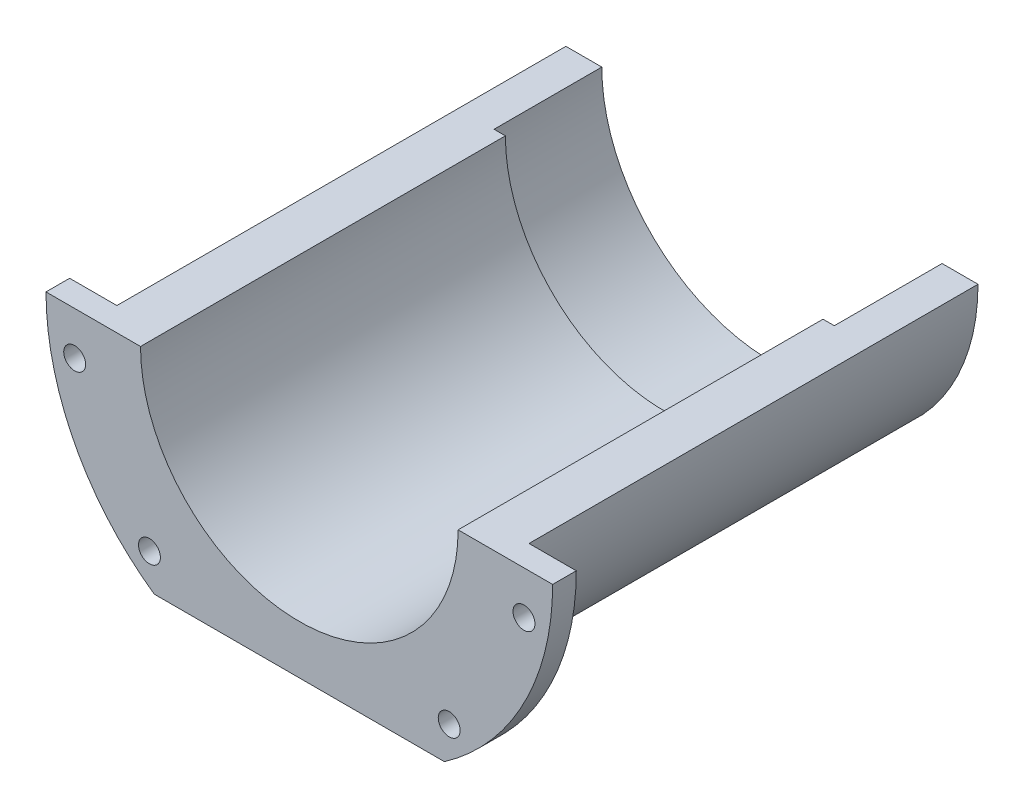
ISO-10303-21;
HEADER;
FILE_DESCRIPTION(('STEP AP214'),'2;1');
FILE_NAME('part.step','',(''),(''),'','','');
FILE_SCHEMA(('AUTOMOTIVE_DESIGN { 1 0 10303 214 1 1 1 1 }'));
ENDSEC;
DATA;
#1=APPLICATION_CONTEXT('core data for automotive mechanical design processes');
#2=APPLICATION_PROTOCOL_DEFINITION('international standard','automotive_design',2000,#1);
#3=PRODUCT_CONTEXT('',#1,'mechanical');
#4=PRODUCT('Part','Part','',(#3));
#5=PRODUCT_RELATED_PRODUCT_CATEGORY('part','',(#4));
#6=PRODUCT_DEFINITION_FORMATION('','',#4);
#7=PRODUCT_DEFINITION_CONTEXT('part definition',#1,'design');
#8=PRODUCT_DEFINITION('design','',#6,#7);
#9=PRODUCT_DEFINITION_SHAPE('','',#8);
#10=(LENGTH_UNIT() NAMED_UNIT(*) SI_UNIT(.MILLI.,.METRE.));
#11=(NAMED_UNIT(*) PLANE_ANGLE_UNIT() SI_UNIT($,.RADIAN.));
#12=(NAMED_UNIT(*) SI_UNIT($,.STERADIAN.) SOLID_ANGLE_UNIT());
#13=UNCERTAINTY_MEASURE_WITH_UNIT(LENGTH_MEASURE(1.E-05),#10,'distance_accuracy_value','');
#14=(GEOMETRIC_REPRESENTATION_CONTEXT(3) GLOBAL_UNCERTAINTY_ASSIGNED_CONTEXT((#13)) GLOBAL_UNIT_ASSIGNED_CONTEXT((#10,
#11,#12)) REPRESENTATION_CONTEXT('',''));
#15=CARTESIAN_POINT('',(0.,0.,0.));
#16=DIRECTION('',(0.,0.,1.));
#17=DIRECTION('',(1.,0.,0.));
#18=AXIS2_PLACEMENT_3D('',#15,#16,#17);
#19=CARTESIAN_POINT('',(0.,0.,63.5));
#20=DIRECTION('',(0.,0.,-1.));
#21=DIRECTION('',(-1.,0.,0.));
#22=AXIS2_PLACEMENT_3D('',#19,#20,#21);
#23=CYLINDRICAL_SURFACE('',#22,21.336);
#24=DIRECTION('',(0.,0.,-1.));
#25=VECTOR('',#24,1.);
#26=CARTESIAN_POINT('',(21.336,0.,63.5));
#27=LINE('',#26,#25);
#28=CARTESIAN_POINT('',(21.336,0.,14.478));
#29=VERTEX_POINT('',#28);
#30=CARTESIAN_POINT('',(21.336,0.,63.5));
#31=VERTEX_POINT('',#30);
#32=EDGE_CURVE('E165',#29,#31,#27,.F.);
#33=ORIENTED_EDGE('',*,*,#32,.F.);
#34=CARTESIAN_POINT('',(0.,0.,14.478));
#35=DIRECTION('',(0.,0.,-1.));
#36=DIRECTION('',(-1.,0.,0.));
#37=AXIS2_PLACEMENT_3D('',#34,#35,#36);
#38=CIRCLE('',#37,21.336);
#39=CARTESIAN_POINT('',(-21.336,0.,14.478));
#40=VERTEX_POINT('',#39);
#41=EDGE_CURVE('E228',#29,#40,#38,.T.);
#42=ORIENTED_EDGE('',*,*,#41,.T.);
#43=DIRECTION('',(0.,0.,-1.));
#44=VECTOR('',#43,1.);
#45=CARTESIAN_POINT('',(-21.336,0.,63.5));
#46=LINE('',#45,#44);
#47=CARTESIAN_POINT('',(-21.336,0.,63.5));
#48=VERTEX_POINT('',#47);
#49=EDGE_CURVE('E153',#48,#40,#46,.T.);
#50=ORIENTED_EDGE('',*,*,#49,.F.);
#51=CARTESIAN_POINT('',(0.,0.,63.5));
#52=DIRECTION('',(0.,0.,1.));
#53=DIRECTION('',(1.,0.,0.));
#54=AXIS2_PLACEMENT_3D('',#51,#52,#53);
#55=CIRCLE('',#54,21.336);
#56=EDGE_CURVE('E251',#48,#31,#55,.T.);
#57=ORIENTED_EDGE('',*,*,#56,.T.);
#58=EDGE_LOOP('',(#33,#42,#50,#57));
#59=FACE_BOUND('',#58,.T.);
#60=ADVANCED_FACE('F49',(#59),#23,.F.);
#61=CARTESIAN_POINT('',(0.,0.,60.325));
#62=DIRECTION('',(0.,0.,1.));
#63=DIRECTION('',(1.,0.,0.));
#64=AXIS2_PLACEMENT_3D('',#61,#62,#63);
#65=CYLINDRICAL_SURFACE('',#64,34.036);
#66=DIRECTION('',(0.,0.,1.));
#67=VECTOR('',#66,1.);
#68=CARTESIAN_POINT('',(-19.4962163427083,-27.8988681547892,60.325));
#69=LINE('',#68,#67);
#70=CARTESIAN_POINT('',(-19.4962163427083,-27.8988681547892,63.5));
#71=VERTEX_POINT('',#70);
#72=CARTESIAN_POINT('',(-19.4962163427083,-27.8988681547892,60.325));
#73=VERTEX_POINT('',#72);
#74=EDGE_CURVE('E72',#71,#73,#69,.F.);
#75=ORIENTED_EDGE('',*,*,#74,.F.);
#76=CARTESIAN_POINT('',(0.,0.,63.5));
#77=DIRECTION('',(0.,0.,1.));
#78=DIRECTION('',(1.,0.,0.));
#79=AXIS2_PLACEMENT_3D('',#76,#77,#78);
#80=CIRCLE('',#79,34.036);
#81=CARTESIAN_POINT('',(-34.036,0.,63.5));
#82=VERTEX_POINT('',#81);
#83=EDGE_CURVE('E151',#82,#71,#80,.T.);
#84=ORIENTED_EDGE('',*,*,#83,.F.);
#85=DIRECTION('',(0.,0.,1.));
#86=VECTOR('',#85,1.);
#87=CARTESIAN_POINT('',(-34.036,0.,60.325));
#88=LINE('',#87,#86);
#89=CARTESIAN_POINT('',(-34.036,0.,60.325));
#90=VERTEX_POINT('',#89);
#91=EDGE_CURVE('E158',#90,#82,#88,.T.);
#92=ORIENTED_EDGE('',*,*,#91,.F.);
#93=CARTESIAN_POINT('',(0.,0.,60.325));
#94=DIRECTION('',(0.,0.,1.));
#95=DIRECTION('',(1.,0.,0.));
#96=AXIS2_PLACEMENT_3D('',#93,#94,#95);
#97=CIRCLE('',#96,34.036);
#98=EDGE_CURVE('E244',#90,#73,#97,.T.);
#99=ORIENTED_EDGE('',*,*,#98,.T.);
#100=EDGE_LOOP('',(#75,#84,#92,#99));
#101=FACE_BOUND('',#100,.T.);
#102=ADVANCED_FACE('F274',(#101),#65,.T.);
#103=CARTESIAN_POINT('',(0.,0.,63.5));
#104=DIRECTION('',(0.,0.,-1.));
#105=DIRECTION('',(-1.,0.,0.));
#106=AXIS2_PLACEMENT_3D('',#103,#104,#105);
#107=CYLINDRICAL_SURFACE('',#106,27.686);
#108=CARTESIAN_POINT('',(0.,0.,60.325));
#109=DIRECTION('',(0.,0.,1.));
#110=DIRECTION('',(1.,0.,0.));
#111=AXIS2_PLACEMENT_3D('',#108,#109,#110);
#112=CIRCLE('',#111,27.686);
#113=CARTESIAN_POINT('',(-27.686,0.,60.325));
#114=VERTEX_POINT('',#113);
#115=CARTESIAN_POINT('',(27.686,0.,60.325));
#116=VERTEX_POINT('',#115);
#117=EDGE_CURVE('E254',#114,#116,#112,.T.);
#118=ORIENTED_EDGE('',*,*,#117,.F.);
#119=DIRECTION('',(0.,0.,-1.));
#120=VECTOR('',#119,1.);
#121=CARTESIAN_POINT('',(-27.686,0.,63.5));
#122=LINE('',#121,#120);
#123=CARTESIAN_POINT('',(-27.686,0.,0.));
#124=VERTEX_POINT('',#123);
#125=EDGE_CURVE('E146',#114,#124,#122,.T.);
#126=ORIENTED_EDGE('',*,*,#125,.T.);
#127=CARTESIAN_POINT('',(0.,0.,0.));
#128=DIRECTION('',(0.,0.,1.));
#129=DIRECTION('',(1.,0.,0.));
#130=AXIS2_PLACEMENT_3D('',#127,#128,#129);
#131=CIRCLE('',#130,27.686);
#132=CARTESIAN_POINT('',(27.686,0.,0.));
#133=VERTEX_POINT('',#132);
#134=EDGE_CURVE('E143',#124,#133,#131,.T.);
#135=ORIENTED_EDGE('',*,*,#134,.T.);
#136=DIRECTION('',(0.,0.,-1.));
#137=VECTOR('',#136,1.);
#138=CARTESIAN_POINT('',(27.686,0.,63.5));
#139=LINE('',#138,#137);
#140=EDGE_CURVE('E159',#133,#116,#139,.F.);
#141=ORIENTED_EDGE('',*,*,#140,.T.);
#142=EDGE_LOOP('',(#118,#126,#135,#141));
#143=FACE_BOUND('',#142,.T.);
#144=ADVANCED_FACE('F271',(#143),#107,.T.);
#145=CARTESIAN_POINT('',(0.,0.,63.5));
#146=DIRECTION('',(0.,0.,1.));
#147=DIRECTION('',(1.,0.,0.));
#148=AXIS2_PLACEMENT_3D('',#145,#146,#147);
#149=PLANE('',#148);
#150=DIRECTION('',(-1.,0.,0.));
#151=VECTOR('',#150,1.);
#152=CARTESIAN_POINT('',(0.,-27.8988681547892,63.5));
#153=LINE('',#152,#151);
#154=CARTESIAN_POINT('',(19.4962163427083,-27.8988681547892,63.5));
#155=VERTEX_POINT('',#154);
#156=EDGE_CURVE('E214',#155,#71,#153,.T.);
#157=ORIENTED_EDGE('',*,*,#156,.F.);
#158=CARTESIAN_POINT('',(34.036,0.,63.5));
#159=VERTEX_POINT('',#158);
#160=EDGE_CURVE('E145',#155,#159,#80,.T.);
#161=ORIENTED_EDGE('',*,*,#160,.T.);
#162=DIRECTION('',(1.,0.,0.));
#163=VECTOR('',#162,1.);
#164=CARTESIAN_POINT('',(0.,0.,63.5));
#165=LINE('',#164,#163);
#166=EDGE_CURVE('E170',#31,#159,#165,.T.);
#167=ORIENTED_EDGE('',*,*,#166,.F.);
#168=ORIENTED_EDGE('',*,*,#56,.F.);
#169=EDGE_CURVE('E163',#82,#48,#165,.T.);
#170=ORIENTED_EDGE('',*,*,#169,.F.);
#171=ORIENTED_EDGE('',*,*,#83,.T.);
#172=EDGE_LOOP('',(#157,#161,#167,#168,#170,#171));
#173=FACE_BOUND('',#172,.T.);
#174=CARTESIAN_POINT('',(30.1839089417745,-5.78978257704961,63.5));
#175=DIRECTION('',(0.,0.,1.));
#176=DIRECTION('',(1.,0.,0.));
#177=AXIS2_PLACEMENT_3D('',#174,#175,#176);
#178=CIRCLE('',#177,1.4732);
#179=CARTESIAN_POINT('',(31.6571089417745,-5.78978257704961,63.5));
#180=VERTEX_POINT('',#179);
#181=EDGE_CURVE('E180',#180,#180,#178,.T.);
#182=ORIENTED_EDGE('',*,*,#181,.F.);
#183=EDGE_LOOP('',(#182));
#184=FACE_BOUND('',#183,.T.);
#185=CARTESIAN_POINT('',(-30.1839089417745,-5.78978257704961,63.5));
#186=DIRECTION('',(0.,0.,1.));
#187=DIRECTION('',(1.,0.,0.));
#188=AXIS2_PLACEMENT_3D('',#185,#186,#187);
#189=CIRCLE('',#188,1.4732);
#190=CARTESIAN_POINT('',(-28.7107089417745,-5.78978257704961,63.5));
#191=VERTEX_POINT('',#190);
#192=EDGE_CURVE('E184',#191,#191,#189,.T.);
#193=ORIENTED_EDGE('',*,*,#192,.F.);
#194=EDGE_LOOP('',(#193));
#195=FACE_BOUND('',#194,.T.);
#196=CARTESIAN_POINT('',(-20.1371678675238,-23.2181913931729,63.5));
#197=DIRECTION('',(0.,0.,1.));
#198=DIRECTION('',(1.,0.,0.));
#199=AXIS2_PLACEMENT_3D('',#196,#197,#198);
#200=CIRCLE('',#199,1.4732);
#201=CARTESIAN_POINT('',(-18.6639678675238,-23.2181913931729,63.5));
#202=VERTEX_POINT('',#201);
#203=EDGE_CURVE('E188',#202,#202,#200,.T.);
#204=ORIENTED_EDGE('',*,*,#203,.F.);
#205=EDGE_LOOP('',(#204));
#206=FACE_BOUND('',#205,.T.);
#207=CARTESIAN_POINT('',(20.1371678675237,-23.2181913931729,63.5));
#208=DIRECTION('',(0.,0.,1.));
#209=DIRECTION('',(1.,0.,0.));
#210=AXIS2_PLACEMENT_3D('',#207,#208,#209);
#211=CIRCLE('',#210,1.4732);
#212=CARTESIAN_POINT('',(21.6103678675237,-23.2181913931729,63.5));
#213=VERTEX_POINT('',#212);
#214=EDGE_CURVE('E192',#213,#213,#211,.T.);
#215=ORIENTED_EDGE('',*,*,#214,.F.);
#216=EDGE_LOOP('',(#215));
#217=FACE_BOUND('',#216,.T.);
#218=ADVANCED_FACE('F273',(#173,#184,#195,#206,#217),#149,.T.);
#219=CARTESIAN_POINT('',(0.,0.,0.));
#220=DIRECTION('',(0.,0.,1.));
#221=DIRECTION('',(1.,0.,0.));
#222=AXIS2_PLACEMENT_3D('',#219,#220,#221);
#223=PLANE('',#222);
#224=DIRECTION('',(1.,0.,0.));
#225=VECTOR('',#224,1.);
#226=CARTESIAN_POINT('',(0.,0.,0.));
#227=LINE('',#226,#225);
#228=CARTESIAN_POINT('',(-22.86,0.,0.));
#229=VERTEX_POINT('',#228);
#230=EDGE_CURVE('E137',#124,#229,#227,.T.);
#231=ORIENTED_EDGE('',*,*,#230,.T.);
#232=CARTESIAN_POINT('',(0.,0.,0.));
#233=DIRECTION('',(0.,0.,-1.));
#234=DIRECTION('',(-1.,0.,0.));
#235=AXIS2_PLACEMENT_3D('',#232,#233,#234);
#236=CIRCLE('',#235,22.86);
#237=CARTESIAN_POINT('',(22.86,0.,0.));
#238=VERTEX_POINT('',#237);
#239=EDGE_CURVE('E125',#238,#229,#236,.T.);
#240=ORIENTED_EDGE('',*,*,#239,.F.);
#241=EDGE_CURVE('E148',#238,#133,#227,.T.);
#242=ORIENTED_EDGE('',*,*,#241,.T.);
#243=ORIENTED_EDGE('',*,*,#134,.F.);
#244=EDGE_LOOP('',(#231,#240,#242,#243));
#245=FACE_BOUND('',#244,.T.);
#246=ADVANCED_FACE('F141',(#245),#223,.F.);
#247=DIRECTION('',(0.,0.,1.));
#248=VECTOR('',#247,1.);
#249=CARTESIAN_POINT('',(19.4962163427083,-27.8988681547892,60.325));
#250=LINE('',#249,#248);
#251=CARTESIAN_POINT('',(19.4962163427083,-27.8988681547892,60.325));
#252=VERTEX_POINT('',#251);
#253=EDGE_CURVE('E217',#252,#155,#250,.T.);
#254=ORIENTED_EDGE('',*,*,#253,.F.);
#255=CARTESIAN_POINT('',(34.036,0.,60.325));
#256=VERTEX_POINT('',#255);
#257=EDGE_CURVE('E247',#252,#256,#97,.T.);
#258=ORIENTED_EDGE('',*,*,#257,.T.);
#259=DIRECTION('',(0.,0.,1.));
#260=VECTOR('',#259,1.);
#261=CARTESIAN_POINT('',(34.036,0.,60.325));
#262=LINE('',#261,#260);
#263=EDGE_CURVE('E176',#159,#256,#262,.F.);
#264=ORIENTED_EDGE('',*,*,#263,.F.);
#265=ORIENTED_EDGE('',*,*,#160,.F.);
#266=EDGE_LOOP('',(#254,#258,#264,#265));
#267=FACE_BOUND('',#266,.T.);
#268=ADVANCED_FACE('F284',(#267),#65,.T.);
#269=CARTESIAN_POINT('',(0.,0.,60.325));
#270=DIRECTION('',(0.,0.,1.));
#271=DIRECTION('',(1.,0.,0.));
#272=AXIS2_PLACEMENT_3D('',#269,#270,#271);
#273=PLANE('',#272);
#274=CARTESIAN_POINT('',(30.1839089417745,-5.78978257704961,60.325));
#275=DIRECTION('',(0.,0.,-1.));
#276=DIRECTION('',(-1.,0.,0.));
#277=AXIS2_PLACEMENT_3D('',#274,#275,#276);
#278=CIRCLE('',#277,1.4732);
#279=CARTESIAN_POINT('',(28.7107089417745,-5.78978257704961,60.325));
#280=VERTEX_POINT('',#279);
#281=EDGE_CURVE('E196',#280,#280,#278,.T.);
#282=ORIENTED_EDGE('',*,*,#281,.F.);
#283=EDGE_LOOP('',(#282));
#284=FACE_BOUND('',#283,.T.);
#285=CARTESIAN_POINT('',(-30.1839089417745,-5.78978257704961,60.325));
#286=DIRECTION('',(0.,0.,-1.));
#287=DIRECTION('',(-1.,0.,0.));
#288=AXIS2_PLACEMENT_3D('',#285,#286,#287);
#289=CIRCLE('',#288,1.4732);
#290=CARTESIAN_POINT('',(-31.6571089417745,-5.78978257704961,60.325));
#291=VERTEX_POINT('',#290);
#292=EDGE_CURVE('E202',#291,#291,#289,.T.);
#293=ORIENTED_EDGE('',*,*,#292,.F.);
#294=EDGE_LOOP('',(#293));
#295=FACE_BOUND('',#294,.T.);
#296=CARTESIAN_POINT('',(-20.1371678675238,-23.2181913931729,60.325));
#297=DIRECTION('',(0.,0.,-1.));
#298=DIRECTION('',(-1.,0.,0.));
#299=AXIS2_PLACEMENT_3D('',#296,#297,#298);
#300=CIRCLE('',#299,1.4732);
#301=CARTESIAN_POINT('',(-21.6103678675238,-23.2181913931729,60.325));
#302=VERTEX_POINT('',#301);
#303=EDGE_CURVE('E197',#302,#302,#300,.T.);
#304=ORIENTED_EDGE('',*,*,#303,.F.);
#305=EDGE_LOOP('',(#304));
#306=FACE_BOUND('',#305,.T.);
#307=CARTESIAN_POINT('',(20.1371678675237,-23.2181913931729,60.325));
#308=DIRECTION('',(0.,0.,-1.));
#309=DIRECTION('',(-1.,0.,0.));
#310=AXIS2_PLACEMENT_3D('',#307,#308,#309);
#311=CIRCLE('',#310,1.4732);
#312=CARTESIAN_POINT('',(18.6639678675237,-23.2181913931729,60.325));
#313=VERTEX_POINT('',#312);
#314=EDGE_CURVE('E201',#313,#313,#311,.T.);
#315=ORIENTED_EDGE('',*,*,#314,.F.);
#316=EDGE_LOOP('',(#315));
#317=FACE_BOUND('',#316,.T.);
#318=ORIENTED_EDGE('',*,*,#257,.F.);
#319=DIRECTION('',(1.,0.,0.));
#320=VECTOR('',#319,1.);
#321=CARTESIAN_POINT('',(22.9354742737972,-27.8988681547892,60.325));
#322=LINE('',#321,#320);
#323=EDGE_CURVE('E220',#73,#252,#322,.T.);
#324=ORIENTED_EDGE('',*,*,#323,.F.);
#325=ORIENTED_EDGE('',*,*,#98,.F.);
#326=DIRECTION('',(1.,0.,0.));
#327=VECTOR('',#326,1.);
#328=CARTESIAN_POINT('',(0.,0.,60.325));
#329=LINE('',#328,#327);
#330=EDGE_CURVE('E262',#90,#114,#329,.T.);
#331=ORIENTED_EDGE('',*,*,#330,.T.);
#332=ORIENTED_EDGE('',*,*,#117,.T.);
#333=EDGE_CURVE('E259',#116,#256,#329,.T.);
#334=ORIENTED_EDGE('',*,*,#333,.T.);
#335=EDGE_LOOP('',(#318,#324,#325,#331,#332,#334));
#336=FACE_BOUND('',#335,.T.);
#337=ADVANCED_FACE('F269',(#284,#295,#306,#317,#336),#273,.F.);
#338=CARTESIAN_POINT('',(45.3508252416647,0.,161.925));
#339=DIRECTION('',(0.,-1.,0.));
#340=DIRECTION('',(0.,0.,-1.));
#341=AXIS2_PLACEMENT_3D('',#338,#339,#340);
#342=PLANE('',#341);
#343=ORIENTED_EDGE('',*,*,#241,.F.);
#344=DIRECTION('',(0.,0.,-1.));
#345=VECTOR('',#344,1.);
#346=CARTESIAN_POINT('',(22.86,0.,14.478));
#347=LINE('',#346,#345);
#348=CARTESIAN_POINT('',(22.86,0.,14.478));
#349=VERTEX_POINT('',#348);
#350=EDGE_CURVE('E129',#238,#349,#347,.F.);
#351=ORIENTED_EDGE('',*,*,#350,.T.);
#352=DIRECTION('',(1.,0.,0.));
#353=VECTOR('',#352,1.);
#354=CARTESIAN_POINT('',(45.3508252416647,0.,14.478));
#355=LINE('',#354,#353);
#356=EDGE_CURVE('E225',#29,#349,#355,.T.);
#357=ORIENTED_EDGE('',*,*,#356,.F.);
#358=ORIENTED_EDGE('',*,*,#32,.T.);
#359=ORIENTED_EDGE('',*,*,#166,.T.);
#360=ORIENTED_EDGE('',*,*,#263,.T.);
#361=ORIENTED_EDGE('',*,*,#333,.F.);
#362=ORIENTED_EDGE('',*,*,#140,.F.);
#363=EDGE_LOOP('',(#343,#351,#357,#358,#359,#360,#361,#362));
#364=FACE_BOUND('',#363,.T.);
#365=ADVANCED_FACE('F307',(#364),#342,.F.);
#366=DIRECTION('',(1.,0.,0.));
#367=VECTOR('',#366,1.);
#368=CARTESIAN_POINT('',(45.3508252416647,0.,14.478));
#369=LINE('',#368,#367);
#370=CARTESIAN_POINT('',(-22.86,0.,14.478));
#371=VERTEX_POINT('',#370);
#372=EDGE_CURVE('E57',#371,#40,#369,.T.);
#373=ORIENTED_EDGE('',*,*,#372,.F.);
#374=DIRECTION('',(0.,0.,-1.));
#375=VECTOR('',#374,1.);
#376=CARTESIAN_POINT('',(-22.86,0.,14.478));
#377=LINE('',#376,#375);
#378=EDGE_CURVE('E11',#371,#229,#377,.T.);
#379=ORIENTED_EDGE('',*,*,#378,.T.);
#380=ORIENTED_EDGE('',*,*,#230,.F.);
#381=ORIENTED_EDGE('',*,*,#125,.F.);
#382=ORIENTED_EDGE('',*,*,#330,.F.);
#383=ORIENTED_EDGE('',*,*,#91,.T.);
#384=ORIENTED_EDGE('',*,*,#169,.T.);
#385=ORIENTED_EDGE('',*,*,#49,.T.);
#386=EDGE_LOOP('',(#373,#379,#380,#381,#382,#383,#384,#385));
#387=FACE_BOUND('',#386,.T.);
#388=ADVANCED_FACE('F136',(#387),#342,.F.);
#389=CARTESIAN_POINT('',(20.1371678675237,-23.2181913931729,161.925));
#390=DIRECTION('',(0.,0.,-1.));
#391=DIRECTION('',(-1.,0.,0.));
#392=AXIS2_PLACEMENT_3D('',#389,#390,#391);
#393=CYLINDRICAL_SURFACE('',#392,1.4732);
#394=ORIENTED_EDGE('',*,*,#214,.T.);
#395=EDGE_LOOP('',(#394));
#396=FACE_BOUND('',#395,.T.);
#397=ORIENTED_EDGE('',*,*,#314,.T.);
#398=EDGE_LOOP('',(#397));
#399=FACE_BOUND('',#398,.T.);
#400=ADVANCED_FACE('F320',(#396,#399),#393,.F.);
#401=CARTESIAN_POINT('',(-20.1371678675238,-23.2181913931729,161.925));
#402=DIRECTION('',(0.,0.,-1.));
#403=DIRECTION('',(-1.,0.,0.));
#404=AXIS2_PLACEMENT_3D('',#401,#402,#403);
#405=CYLINDRICAL_SURFACE('',#404,1.4732);
#406=ORIENTED_EDGE('',*,*,#203,.T.);
#407=EDGE_LOOP('',(#406));
#408=FACE_BOUND('',#407,.T.);
#409=ORIENTED_EDGE('',*,*,#303,.T.);
#410=EDGE_LOOP('',(#409));
#411=FACE_BOUND('',#410,.T.);
#412=ADVANCED_FACE('F349',(#408,#411),#405,.F.);
#413=CARTESIAN_POINT('',(-30.1839089417745,-5.78978257704961,161.925));
#414=DIRECTION('',(0.,0.,-1.));
#415=DIRECTION('',(-1.,0.,0.));
#416=AXIS2_PLACEMENT_3D('',#413,#414,#415);
#417=CYLINDRICAL_SURFACE('',#416,1.4732);
#418=ORIENTED_EDGE('',*,*,#192,.T.);
#419=EDGE_LOOP('',(#418));
#420=FACE_BOUND('',#419,.T.);
#421=ORIENTED_EDGE('',*,*,#292,.T.);
#422=EDGE_LOOP('',(#421));
#423=FACE_BOUND('',#422,.T.);
#424=ADVANCED_FACE('F345',(#420,#423),#417,.F.);
#425=CARTESIAN_POINT('',(30.1839089417745,-5.78978257704961,161.925));
#426=DIRECTION('',(0.,0.,-1.));
#427=DIRECTION('',(-1.,0.,0.));
#428=AXIS2_PLACEMENT_3D('',#425,#426,#427);
#429=CYLINDRICAL_SURFACE('',#428,1.4732);
#430=ORIENTED_EDGE('',*,*,#181,.T.);
#431=EDGE_LOOP('',(#430));
#432=FACE_BOUND('',#431,.T.);
#433=ORIENTED_EDGE('',*,*,#281,.T.);
#434=EDGE_LOOP('',(#433));
#435=FACE_BOUND('',#434,.T.);
#436=ADVANCED_FACE('F342',(#432,#435),#429,.F.);
#437=CARTESIAN_POINT('',(22.9354742737972,-27.8988681547892,161.925));
#438=DIRECTION('',(0.,1.,0.));
#439=DIRECTION('',(0.,0.,1.));
#440=AXIS2_PLACEMENT_3D('',#437,#438,#439);
#441=PLANE('',#440);
#442=ORIENTED_EDGE('',*,*,#74,.T.);
#443=ORIENTED_EDGE('',*,*,#323,.T.);
#444=ORIENTED_EDGE('',*,*,#253,.T.);
#445=ORIENTED_EDGE('',*,*,#156,.T.);
#446=EDGE_LOOP('',(#442,#443,#444,#445));
#447=FACE_BOUND('',#446,.T.);
#448=ADVANCED_FACE('F295',(#447),#441,.F.);
#449=CARTESIAN_POINT('',(0.,0.,14.478));
#450=DIRECTION('',(0.,0.,-1.));
#451=DIRECTION('',(-1.,0.,0.));
#452=AXIS2_PLACEMENT_3D('',#449,#450,#451);
#453=CYLINDRICAL_SURFACE('',#452,22.86);
#454=ORIENTED_EDGE('',*,*,#239,.T.);
#455=ORIENTED_EDGE('',*,*,#378,.F.);
#456=CARTESIAN_POINT('',(0.,0.,14.478));
#457=DIRECTION('',(0.,0.,-1.));
#458=DIRECTION('',(-1.,0.,0.));
#459=AXIS2_PLACEMENT_3D('',#456,#457,#458);
#460=CIRCLE('',#459,22.86);
#461=EDGE_CURVE('E64',#349,#371,#460,.T.);
#462=ORIENTED_EDGE('',*,*,#461,.F.);
#463=ORIENTED_EDGE('',*,*,#350,.F.);
#464=EDGE_LOOP('',(#454,#455,#462,#463));
#465=FACE_BOUND('',#464,.T.);
#466=ADVANCED_FACE('F126',(#465),#453,.F.);
#467=CARTESIAN_POINT('',(0.,0.,14.478));
#468=DIRECTION('',(0.,0.,-1.));
#469=DIRECTION('',(-1.,0.,0.));
#470=AXIS2_PLACEMENT_3D('',#467,#468,#469);
#471=PLANE('',#470);
#472=ORIENTED_EDGE('',*,*,#356,.T.);
#473=ORIENTED_EDGE('',*,*,#461,.T.);
#474=ORIENTED_EDGE('',*,*,#372,.T.);
#475=ORIENTED_EDGE('',*,*,#41,.F.);
#476=EDGE_LOOP('',(#472,#473,#474,#475));
#477=FACE_BOUND('',#476,.T.);
#478=ADVANCED_FACE('F328',(#477),#471,.T.);
#479=CLOSED_SHELL('',(#60,#102,#144,#218,#246,#268,#337,#365,#388,#400,#412,#424,#436,#448,#466,#478));
#480=MANIFOLD_SOLID_BREP('B2',#479);
#481=ADVANCED_BREP_SHAPE_REPRESENTATION('',(#18,#480),#14);
#482=SHAPE_DEFINITION_REPRESENTATION(#9,#481);
ENDSEC;
END-ISO-10303-21;
